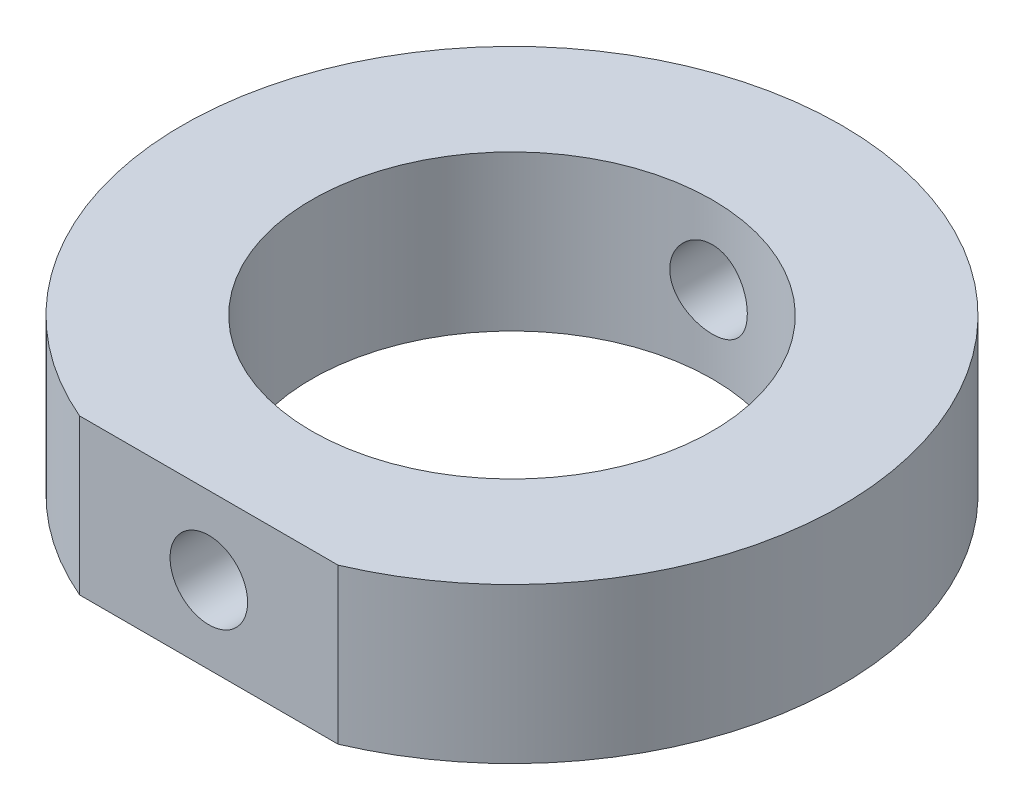
ISO-10303-21;
HEADER;
FILE_DESCRIPTION(('STEP AP214'),'2;1');
FILE_NAME('part.step','',(''),(''),'','','');
FILE_SCHEMA(('AUTOMOTIVE_DESIGN { 1 0 10303 214 1 1 1 1 }'));
ENDSEC;
DATA;
#1=APPLICATION_CONTEXT('core data for automotive mechanical design processes');
#2=APPLICATION_PROTOCOL_DEFINITION('international standard','automotive_design',2000,#1);
#3=PRODUCT_CONTEXT('',#1,'mechanical');
#4=PRODUCT('Part','Part','',(#3));
#5=PRODUCT_RELATED_PRODUCT_CATEGORY('part','',(#4));
#6=PRODUCT_DEFINITION_FORMATION('','',#4);
#7=PRODUCT_DEFINITION_CONTEXT('part definition',#1,'design');
#8=PRODUCT_DEFINITION('design','',#6,#7);
#9=PRODUCT_DEFINITION_SHAPE('','',#8);
#10=(LENGTH_UNIT() NAMED_UNIT(*) SI_UNIT(.MILLI.,.METRE.));
#11=(NAMED_UNIT(*) PLANE_ANGLE_UNIT() SI_UNIT($,.RADIAN.));
#12=(NAMED_UNIT(*) SI_UNIT($,.STERADIAN.) SOLID_ANGLE_UNIT());
#13=UNCERTAINTY_MEASURE_WITH_UNIT(LENGTH_MEASURE(1.E-05),#10,'distance_accuracy_value','');
#14=(GEOMETRIC_REPRESENTATION_CONTEXT(3) GLOBAL_UNCERTAINTY_ASSIGNED_CONTEXT((#13)) GLOBAL_UNIT_ASSIGNED_CONTEXT((#10,
#11,#12)) REPRESENTATION_CONTEXT('',''));
#15=CARTESIAN_POINT('',(0.,0.,0.));
#16=DIRECTION('',(0.,0.,1.));
#17=DIRECTION('',(1.,0.,0.));
#18=AXIS2_PLACEMENT_3D('',#15,#16,#17);
#19=CARTESIAN_POINT('',(0.,6.,0.));
#20=DIRECTION('',(0.,-1.,0.));
#21=DIRECTION('',(0.,0.,-1.));
#22=AXIS2_PLACEMENT_3D('',#19,#20,#21);
#23=PLANE('',#22);
#24=CARTESIAN_POINT('',(0.,6.,0.));
#25=DIRECTION('',(0.,1.,0.));
#26=DIRECTION('',(0.,0.,-1.));
#27=AXIS2_PLACEMENT_3D('',#24,#25,#26);
#28=CIRCLE('',#27,12.75);
#29=CARTESIAN_POINT('',(5.,6.,11.7287041057399));
#30=VERTEX_POINT('',#29);
#31=CARTESIAN_POINT('',(-5.,6.,11.7287041057399));
#32=VERTEX_POINT('',#31);
#33=EDGE_CURVE('E86',#30,#32,#28,.T.);
#34=ORIENTED_EDGE('',*,*,#33,.T.);
#35=DIRECTION('',(1.,0.,0.));
#36=VECTOR('',#35,1.);
#37=CARTESIAN_POINT('',(-5.,6.,11.7287041057399));
#38=LINE('',#37,#36);
#39=EDGE_CURVE('E70',#32,#30,#38,.T.);
#40=ORIENTED_EDGE('',*,*,#39,.T.);
#41=EDGE_LOOP('',(#34,#40));
#42=FACE_BOUND('',#41,.T.);
#43=CARTESIAN_POINT('',(0.,6.,0.));
#44=DIRECTION('',(0.,1.,0.));
#45=DIRECTION('',(0.,0.,1.));
#46=AXIS2_PLACEMENT_3D('',#43,#44,#45);
#47=CIRCLE('',#46,7.75);
#48=CARTESIAN_POINT('',(0.,6.,7.75));
#49=VERTEX_POINT('',#48);
#50=EDGE_CURVE('E95',#49,#49,#47,.T.);
#51=ORIENTED_EDGE('',*,*,#50,.F.);
#52=EDGE_LOOP('',(#51));
#53=FACE_BOUND('',#52,.T.);
#54=ADVANCED_FACE('F45',(#42,#53),#23,.F.);
#55=CARTESIAN_POINT('',(0.,0.,0.));
#56=DIRECTION('',(0.,-1.,0.));
#57=DIRECTION('',(0.,0.,-1.));
#58=AXIS2_PLACEMENT_3D('',#55,#56,#57);
#59=PLANE('',#58);
#60=CARTESIAN_POINT('',(0.,0.,0.));
#61=DIRECTION('',(0.,1.,0.));
#62=DIRECTION('',(0.,0.,-1.));
#63=AXIS2_PLACEMENT_3D('',#60,#61,#62);
#64=CIRCLE('',#63,12.75);
#65=CARTESIAN_POINT('',(5.,0.,11.7287041057399));
#66=VERTEX_POINT('',#65);
#67=CARTESIAN_POINT('',(-5.,0.,11.7287041057399));
#68=VERTEX_POINT('',#67);
#69=EDGE_CURVE('E87',#66,#68,#64,.T.);
#70=ORIENTED_EDGE('',*,*,#69,.F.);
#71=DIRECTION('',(1.,0.,0.));
#72=VECTOR('',#71,1.);
#73=CARTESIAN_POINT('',(-5.,0.,11.7287041057399));
#74=LINE('',#73,#72);
#75=EDGE_CURVE('E78',#68,#66,#74,.T.);
#76=ORIENTED_EDGE('',*,*,#75,.F.);
#77=EDGE_LOOP('',(#70,#76));
#78=FACE_BOUND('',#77,.T.);
#79=CARTESIAN_POINT('',(0.,0.,0.));
#80=DIRECTION('',(0.,1.,0.));
#81=DIRECTION('',(0.,0.,1.));
#82=AXIS2_PLACEMENT_3D('',#79,#80,#81);
#83=CIRCLE('',#82,7.75);
#84=CARTESIAN_POINT('',(0.,0.,7.75));
#85=VERTEX_POINT('',#84);
#86=EDGE_CURVE('E99',#85,#85,#83,.T.);
#87=ORIENTED_EDGE('',*,*,#86,.T.);
#88=EDGE_LOOP('',(#87));
#89=FACE_BOUND('',#88,.T.);
#90=ADVANCED_FACE('F92',(#78,#89),#59,.T.);
#91=CARTESIAN_POINT('',(0.,6.,0.));
#92=DIRECTION('',(0.,-1.,0.));
#93=DIRECTION('',(0.,0.,-1.));
#94=AXIS2_PLACEMENT_3D('',#91,#92,#93);
#95=CYLINDRICAL_SURFACE('',#94,12.75);
#96=CARTESIAN_POINT('',(0.,1.5,-12.75));
#97=CARTESIAN_POINT('',(0.0839445238017769,1.50000358968787,-12.7499988863998));
#98=CARTESIAN_POINT('',(0.167942470163587,1.50707043173212,-12.7491622059457));
#99=CARTESIAN_POINT('',(0.333603720017564,1.53515144231694,-12.74590499263));
#100=CARTESIAN_POINT('',(0.415264446886993,1.55618042878211,-12.7434827770899));
#101=CARTESIAN_POINT('',(0.573828777464401,1.61155994331746,-12.7373275435105));
#102=CARTESIAN_POINT('',(0.650735441768553,1.64590179498285,-12.7335953793546));
#103=CARTESIAN_POINT('',(0.797678339972702,1.72691387258974,-12.7252360454028));
#104=CARTESIAN_POINT('',(0.867715808463592,1.77358187758043,-12.7206090368819));
#105=CARTESIAN_POINT('',(0.99929086233086,1.87816638509886,-12.7109517928896));
#106=CARTESIAN_POINT('',(1.06078994573301,1.93613117612404,-12.7059198828822));
#107=CARTESIAN_POINT('',(1.17321109755621,2.0615603215165,-12.6960335724401));
#108=CARTESIAN_POINT('',(1.224132643315,2.12902514502759,-12.6911791807867));
#109=CARTESIAN_POINT('',(1.31409465484568,2.27178686024288,-12.6821809090172));
#110=CARTESIAN_POINT('',(1.3530994028419,2.34710640698438,-12.6780391808357));
#111=CARTESIAN_POINT('',(1.41789253518226,2.50328336365698,-12.6709569272581));
#112=CARTESIAN_POINT('',(1.44368136485536,2.58414058688419,-12.6680163613879));
#113=CARTESIAN_POINT('',(1.4811944199708,2.74869991374292,-12.6636851530451));
#114=CARTESIAN_POINT('',(1.49298334554177,2.83238707745297,-12.662287382723));
#115=CARTESIAN_POINT('',(1.50236208892495,3.00056284546421,-12.6611781333382));
#116=CARTESIAN_POINT('',(1.49995241481201,3.08505142098012,-12.6614665939364));
#117=CARTESIAN_POINT('',(1.48105553765642,3.2519823500222,-12.6636906931516));
#118=CARTESIAN_POINT('',(1.4646394043017,3.33443287525134,-12.6656180159087));
#119=CARTESIAN_POINT('',(1.41830639263226,3.49540056102071,-12.6708897060061));
#120=CARTESIAN_POINT('',(1.38838926944282,3.57391765018937,-12.6742340990486));
#121=CARTESIAN_POINT('',(1.3158264763494,3.72501161794973,-12.6819725804852));
#122=CARTESIAN_POINT('',(1.27314971803356,3.79757342997342,-12.6863692273787));
#123=CARTESIAN_POINT('',(1.17630136070668,3.93453205552891,-12.695714796948));
#124=CARTESIAN_POINT('',(1.12212929576825,3.99892853793477,-12.7006637420056));
#125=CARTESIAN_POINT('',(1.00343322690704,4.11814118716693,-12.7105932908786));
#126=CARTESIAN_POINT('',(0.938847926412598,4.17289634082805,-12.7155739031702));
#127=CARTESIAN_POINT('',(0.801370343056217,4.27079766100761,-12.7249771989112));
#128=CARTESIAN_POINT('',(0.728478044572468,4.3139438056941,-12.7293998813114));
#129=CARTESIAN_POINT('',(0.576410071646914,4.38740160066974,-12.7371913118727));
#130=CARTESIAN_POINT('',(0.497232646746879,4.41770966045214,-12.7405597651223));
#131=CARTESIAN_POINT('',(0.334864099663829,4.46458369808535,-12.7458604426276));
#132=CARTESIAN_POINT('',(0.251673143970352,4.4811502454447,-12.7477927264041));
#133=CARTESIAN_POINT('',(0.0841668293733031,4.49999244834819,-12.7499956438523));
#134=CARTESIAN_POINT('',(-0.000138946641102072,4.50235219804915,-12.750276055223));
#135=CARTESIAN_POINT('',(-0.167944751818134,4.49293541256864,-12.7491699754329));
#136=CARTESIAN_POINT('',(-0.251444796110695,4.48115914335441,-12.747783515634));
#137=CARTESIAN_POINT('',(-0.415022458911957,4.44387443839986,-12.7435056127914));
#138=CARTESIAN_POINT('',(-0.495109288820112,4.41840587144105,-12.7406185399892));
#139=CARTESIAN_POINT('',(-0.649874743903773,4.35450082818682,-12.7336628348918));
#140=CARTESIAN_POINT('',(-0.724553204671253,4.31606395787112,-12.7295941666962));
#141=CARTESIAN_POINT('',(-0.866759123025255,4.22710831778111,-12.7207049523328));
#142=CARTESIAN_POINT('',(-0.934252169210274,4.17653487948445,-12.7158810393999));
#143=CARTESIAN_POINT('',(-1.05982183694368,4.06481936695087,-12.7060321235032));
#144=CARTESIAN_POINT('',(-1.11789812863895,4.00367692265433,-12.7010071135029));
#145=CARTESIAN_POINT('',(-1.22328206862583,3.87218966579649,-12.6912924167809));
#146=CARTESIAN_POINT('',(-1.27053414492072,3.80180016043869,-12.6866045417088));
#147=CARTESIAN_POINT('',(-1.35254502918872,3.65403487361152,-12.678124032712));
#148=CARTESIAN_POINT('',(-1.38730406313073,3.57665921853638,-12.6743313825954));
#149=CARTESIAN_POINT('',(-1.44325123543802,3.4173009128721,-12.6680828015291));
#150=CARTESIAN_POINT('',(-1.46447125296069,3.3353295825964,-12.6656237325762));
#151=CARTESIAN_POINT('',(-1.49284095573644,3.16895654684123,-12.6623115270215));
#152=CARTESIAN_POINT('',(-1.49999121512984,3.08455494067589,-12.6614583248896));
#153=CARTESIAN_POINT('',(-1.50000871531396,2.91626987777497,-12.6614562076871));
#154=CARTESIAN_POINT('',(-1.49296325449793,2.83238641677722,-12.662296875945));
#155=CARTESIAN_POINT('',(-1.46497359599684,2.66700436588238,-12.6655654420645));
#156=CARTESIAN_POINT('',(-1.44402939180228,2.58550577710227,-12.6679933406696));
#157=CARTESIAN_POINT('',(-1.38886308611661,2.42721502791031,-12.6741596896421));
#158=CARTESIAN_POINT('',(-1.35464468084386,2.35042156423695,-12.6778977751583));
#159=CARTESIAN_POINT('',(-1.27390996227888,2.20365295769552,-12.6862639594338));
#160=CARTESIAN_POINT('',(-1.22739356481404,2.13367786149971,-12.6908920642846));
#161=CARTESIAN_POINT('',(-1.12305792897877,2.00208555975102,-12.7005509388172));
#162=CARTESIAN_POINT('',(-1.06517358276859,1.94052013601489,-12.7055839244218));
#163=CARTESIAN_POINT('',(-0.939879579424026,1.82794187041473,-12.7154656568386));
#164=CARTESIAN_POINT('',(-0.872467669264752,1.77693153160867,-12.7203143597275));
#165=CARTESIAN_POINT('',(-0.729773340821654,1.68676725529446,-12.7292990710803));
#166=CARTESIAN_POINT('',(-0.654465054514433,1.64765403417534,-12.7334326116393));
#167=CARTESIAN_POINT('',(-0.498344623668371,1.58268355476477,-12.7404958231895));
#168=CARTESIAN_POINT('',(-0.417538642694656,1.5568117199707,-12.7434268172705));
#169=CARTESIAN_POINT('',(-0.280251375756951,1.52533370656963,-12.7470386021763));
#170=CARTESIAN_POINT('',(-0.224639844767083,1.51584700409509,-12.7481437901749));
#171=CARTESIAN_POINT('',(-0.112693566298985,1.50317896552839,-12.7496248606286));
#172=CARTESIAN_POINT('',(-0.0563588233521066,1.49999758994899,-12.7500007476509));
#173=CARTESIAN_POINT('',(0.,1.5,-12.75));
#174=B_SPLINE_CURVE_WITH_KNOTS('',3,(#96,#97,#98,#99,#100,#101,#102,#103,#104,#105,#106,#107,
#108,#109,#110,#111,#112,#113,#114,#115,#116,#117,#118,#119,#120,#121,#122,#123,#124,#125,#126,
#127,#128,#129,#130,#131,#132,#133,#134,#135,#136,#137,#138,#139,#140,#141,#142,#143,#144,#145,
#146,#147,#148,#149,#150,#151,#152,#153,#154,#155,#156,#157,#158,#159,#160,#161,#162,#163,#164,
#165,#166,#167,#168,#169,#170,#171,#172,#173),.UNSPECIFIED.,.T.,.F.,(4,2,2,2,2,2,2,2,2,2,2,2,2,
2,2,2,2,2,2,2,2,2,2,2,2,2,2,2,2,2,2,2,2,2,2,2,2,2,4),(0.,0.251627729781729,0.503522938067275,
0.75525425373159,1.00694024285275,1.25972665179056,1.51252554855898,1.76607488029362,
2.01961566776529,2.27198010689134,2.5243355156027,2.77541801991742,3.02650507843398,
3.27820895762529,3.52992304081927,3.78317687865799,4.03643119276375,4.28975628938195,
4.54307088657282,4.79488455520337,5.04669348606903,5.29777314794787,5.54886043915063,
5.80110070045379,6.05334979540249,6.30686628875544,6.56037819637747,6.81329095670036,
7.06619339627562,7.31754532700981,7.56889737546506,7.82017948479908,8.07146331405794,
8.32423065993315,8.57705787913526,8.83074087667477,9.08414400868152,9.25308333841263,
9.42202161015442),.UNSPECIFIED.);
#175=CARTESIAN_POINT('',(0.,1.5,-12.75));
#176=VERTEX_POINT('',#175);
#177=EDGE_CURVE('E121',#176,#176,#174,.T.);
#178=ORIENTED_EDGE('',*,*,#177,.T.);
#179=EDGE_LOOP('',(#178));
#180=FACE_BOUND('',#179,.T.);
#181=ORIENTED_EDGE('',*,*,#69,.T.);
#182=DIRECTION('',(0.,-1.,0.));
#183=VECTOR('',#182,1.);
#184=CARTESIAN_POINT('',(-5.,6.,11.7287041057399));
#185=LINE('',#184,#183);
#186=EDGE_CURVE('E11',#32,#68,#185,.T.);
#187=ORIENTED_EDGE('',*,*,#186,.F.);
#188=ORIENTED_EDGE('',*,*,#33,.F.);
#189=DIRECTION('',(0.,-1.,0.));
#190=VECTOR('',#189,1.);
#191=CARTESIAN_POINT('',(5.,6.,11.7287041057399));
#192=LINE('',#191,#190);
#193=EDGE_CURVE('E62',#30,#66,#192,.T.);
#194=ORIENTED_EDGE('',*,*,#193,.T.);
#195=EDGE_LOOP('',(#181,#187,#188,#194));
#196=FACE_BOUND('',#195,.T.);
#197=ADVANCED_FACE('F47',(#180,#196),#95,.T.);
#198=CARTESIAN_POINT('',(-5.,6.,11.7287041057399));
#199=DIRECTION('',(0.,0.,-1.));
#200=DIRECTION('',(-1.,0.,0.));
#201=AXIS2_PLACEMENT_3D('',#198,#199,#200);
#202=PLANE('',#201);
#203=CARTESIAN_POINT('',(0.,3.,11.7287041057399));
#204=DIRECTION('',(0.,0.,1.));
#205=DIRECTION('',(1.,0.,0.));
#206=AXIS2_PLACEMENT_3D('',#203,#204,#205);
#207=CIRCLE('',#206,1.5);
#208=CARTESIAN_POINT('',(1.5,3.,11.7287041057399));
#209=VERTEX_POINT('',#208);
#210=EDGE_CURVE('E109',#209,#209,#207,.T.);
#211=ORIENTED_EDGE('',*,*,#210,.F.);
#212=EDGE_LOOP('',(#211));
#213=FACE_BOUND('',#212,.T.);
#214=ORIENTED_EDGE('',*,*,#75,.T.);
#215=ORIENTED_EDGE('',*,*,#193,.F.);
#216=ORIENTED_EDGE('',*,*,#39,.F.);
#217=ORIENTED_EDGE('',*,*,#186,.T.);
#218=EDGE_LOOP('',(#214,#215,#216,#217));
#219=FACE_BOUND('',#218,.T.);
#220=ADVANCED_FACE('F81',(#213,#219),#202,.F.);
#221=CARTESIAN_POINT('',(0.,6.,0.));
#222=DIRECTION('',(0.,-1.,0.));
#223=DIRECTION('',(0.,0.,-1.));
#224=AXIS2_PLACEMENT_3D('',#221,#222,#223);
#225=CYLINDRICAL_SURFACE('',#224,7.75);
#226=CARTESIAN_POINT('',(0.,4.5,-7.75));
#227=CARTESIAN_POINT('',(-0.0834210787139819,4.49999686731769,-7.74999847408196));
#228=CARTESIAN_POINT('',(-0.166882359307396,4.49301740865632,-7.74863921449565));
#229=CARTESIAN_POINT('',(-0.331449592125704,4.46530395337289,-7.74334791734644));
#230=CARTESIAN_POINT('',(-0.412553555037757,4.44455867266346,-7.73941376913806));
#231=CARTESIAN_POINT('',(-0.570002657544576,4.38997538033738,-7.72941240772484));
#232=CARTESIAN_POINT('',(-0.64635214294661,4.35614953511509,-7.7233471771437));
#233=CARTESIAN_POINT('',(-0.792285992836983,4.27640061901852,-7.70974455178129));
#234=CARTESIAN_POINT('',(-0.861870835242917,4.23047840359644,-7.70220726111347));
#235=CARTESIAN_POINT('',(-0.99319167595435,4.12722046724469,-7.6863840905269));
#236=CARTESIAN_POINT('',(-1.05482918133122,4.06976063022284,-7.67809065789604));
#237=CARTESIAN_POINT('',(-1.16765325234664,3.9453254304938,-7.66174545065496));
#238=CARTESIAN_POINT('',(-1.2188390366218,3.87834935699369,-7.65369369415063));
#239=CARTESIAN_POINT('',(-1.30972091001982,3.73608090868428,-7.63866991902306));
#240=CARTESIAN_POINT('',(-1.3493159525154,3.66072286671957,-7.63170762900968));
#241=CARTESIAN_POINT('',(-1.41524529666488,3.50426687565965,-7.61975791069809));
#242=CARTESIAN_POINT('',(-1.44158082073674,3.42316945647407,-7.6147703003598));
#243=CARTESIAN_POINT('',(-1.47992571756973,3.2585934372158,-7.60741086759107));
#244=CARTESIAN_POINT('',(-1.49210735695917,3.17515640746075,-7.60500761838759));
#245=CARTESIAN_POINT('',(-1.50233357526115,3.00739085682817,-7.60299433869807));
#246=CARTESIAN_POINT('',(-1.50037950628534,2.92306242198599,-7.60338404106004));
#247=CARTESIAN_POINT('',(-1.48252926887088,2.75716172079978,-7.60688404856427));
#248=CARTESIAN_POINT('',(-1.4668297435929,2.67556736674805,-7.60995597992223));
#249=CARTESIAN_POINT('',(-1.42224426701012,2.51619296499398,-7.61841397136506));
#250=CARTESIAN_POINT('',(-1.39335772220132,2.43841308914313,-7.62380013560523));
#251=CARTESIAN_POINT('',(-1.32302804854628,2.28830429148535,-7.63631940233068));
#252=CARTESIAN_POINT('',(-1.28150621416483,2.2160131913663,-7.64346339941792));
#253=CARTESIAN_POINT('',(-1.18714021425914,2.07935053899544,-7.65868628007988));
#254=CARTESIAN_POINT('',(-1.13429482702252,2.0149798424666,-7.66676526448826));
#255=CARTESIAN_POINT('',(-1.01772509823794,1.89484979118729,-7.68311457012869));
#256=CARTESIAN_POINT('',(-0.953832732873424,1.83925347913067,-7.6913858240859));
#257=CARTESIAN_POINT('',(-0.817543107605094,1.73954276410473,-7.70706304694415));
#258=CARTESIAN_POINT('',(-0.745145751494432,1.6954284910362,-7.71446900605523));
#259=CARTESIAN_POINT('',(-0.593725914754121,1.61990715897721,-7.72759765137465));
#260=CARTESIAN_POINT('',(-0.514694360575272,1.58851785724516,-7.73331798232966));
#261=CARTESIAN_POINT('',(-0.352344598280829,1.53950661287005,-7.74241280644494));
#262=CARTESIAN_POINT('',(-0.269026877044974,1.52188311018931,-7.74578756541723));
#263=CARTESIAN_POINT('',(-0.101871802484302,1.50113252155269,-7.74977424845929));
#264=CARTESIAN_POINT('',(-0.0180631478958456,1.49778217018744,-7.75042872018128));
#265=CARTESIAN_POINT('',(0.148916632529926,1.50507296083675,-7.74901892693282));
#266=CARTESIAN_POINT('',(0.232087791602669,1.51571336839246,-7.74695480467765));
#267=CARTESIAN_POINT('',(0.394717725412861,1.55049807235455,-7.7403663072359));
#268=CARTESIAN_POINT('',(0.474201738407223,1.57452864109975,-7.73586266070818));
#269=CARTESIAN_POINT('',(0.628012475405678,1.6352878833816,-7.72489811710861));
#270=CARTESIAN_POINT('',(0.702338831219204,1.67201746234729,-7.71843708048053));
#271=CARTESIAN_POINT('',(0.844671894023758,1.75762094227588,-7.7041683619824));
#272=CARTESIAN_POINT('',(0.912595621279698,1.80663031218863,-7.69634597748223));
#273=CARTESIAN_POINT('',(1.03933496632102,1.91521978461092,-7.68025855618537));
#274=CARTESIAN_POINT('',(1.09814967272472,1.97480094357803,-7.67199347520694));
#275=CARTESIAN_POINT('',(1.20585617272696,2.10385618280201,-7.65580995071658));
#276=CARTESIAN_POINT('',(1.25459516224029,2.17345875641351,-7.64789809799975));
#277=CARTESIAN_POINT('',(1.33969011925474,2.31999423858008,-7.63345275472628));
#278=CARTESIAN_POINT('',(1.37604656466947,2.39692686407959,-7.62691921097647));
#279=CARTESIAN_POINT('',(1.43513157210702,2.55556290858282,-7.61602267841533));
#280=CARTESIAN_POINT('',(1.45792829947187,2.6372401593918,-7.61164885180106));
#281=CARTESIAN_POINT('',(1.48945537425568,2.80335883926439,-7.60554305407608));
#282=CARTESIAN_POINT('',(1.49818742553264,2.88779993223897,-7.60381076295927));
#283=CARTESIAN_POINT('',(1.50127736967434,3.05551705239209,-7.60320113886837));
#284=CARTESIAN_POINT('',(1.49587649128859,3.13878855577927,-7.60427589307599));
#285=CARTESIAN_POINT('',(1.47138405136503,3.30321243066356,-7.60905263452398));
#286=CARTESIAN_POINT('',(1.45229258467931,3.38436481683845,-7.61275460356229));
#287=CARTESIAN_POINT('',(1.40106548612556,3.54210576871194,-7.62234788207545));
#288=CARTESIAN_POINT('',(1.36895762664975,3.61870365557393,-7.62823452797357));
#289=CARTESIAN_POINT('',(1.29263615483108,3.76546343788171,-7.64153687010842));
#290=CARTESIAN_POINT('',(1.24842161044272,3.83562483725251,-7.64895268405886));
#291=CARTESIAN_POINT('',(1.14831022070382,3.96872497905872,-7.66462550473274));
#292=CARTESIAN_POINT('',(1.09223845338799,4.03153082047092,-7.67289403231619));
#293=CARTESIAN_POINT('',(0.970367356758542,4.14692213338329,-7.68925611889744));
#294=CARTESIAN_POINT('',(0.904565796081146,4.19950525405505,-7.69734963727052));
#295=CARTESIAN_POINT('',(0.764337841919685,4.29343704993912,-7.71254202408635));
#296=CARTESIAN_POINT('',(0.689834048073539,4.33467191895233,-7.71963049375684));
#297=CARTESIAN_POINT('',(0.534840677982818,4.40397224097681,-7.73191220790458));
#298=CARTESIAN_POINT('',(0.454356695930214,4.43204982672331,-7.73710719743173));
#299=CARTESIAN_POINT('',(0.311385193383974,4.46866252966338,-7.74398117253215));
#300=CARTESIAN_POINT('',(0.249723311606212,4.48039358676935,-7.74622526720601));
#301=CARTESIAN_POINT('',(0.125381838034376,4.49606338868456,-7.74923523343163));
#302=CARTESIAN_POINT('',(0.0627022751733916,4.5000023546364,-7.75000114693474));
#303=CARTESIAN_POINT('',(0.,4.5,-7.75));
#304=B_SPLINE_CURVE_WITH_KNOTS('',3,(#226,#227,#228,#229,#230,#231,#232,#233,#234,#235,#236,
#237,#238,#239,#240,#241,#242,#243,#244,#245,#246,#247,#248,#249,#250,#251,#252,#253,#254,#255,
#256,#257,#258,#259,#260,#261,#262,#263,#264,#265,#266,#267,#268,#269,#270,#271,#272,#273,#274,
#275,#276,#277,#278,#279,#280,#281,#282,#283,#284,#285,#286,#287,#288,#289,#290,#291,#292,#293,
#294,#295,#296,#297,#298,#299,#300,#301,#302,#303),.UNSPECIFIED.,.T.,.F.,(4,2,2,2,2,2,2,2,2,2,2,
2,2,2,2,2,2,2,2,2,2,2,2,2,2,2,2,2,2,2,2,2,2,2,2,2,2,2,4),(0.,0.250033893279061,
0.500272997362748,0.750279908627459,1.00026914421188,1.25310753798955,1.5059648268747,
1.76096497917487,2.01594161826314,2.26778131268177,2.51959691839715,2.76786784168443,
3.01614993992392,3.26601139971541,3.51589983096031,3.76999112259671,4.02408528874255,
4.27853282397684,4.53295151923209,4.78337555478589,5.03378644460482,5.28210222477901,
5.53043571331732,5.78163969279567,6.03286878968402,6.28766619193877,6.5424537589811,
6.79594942792411,7.04941438495324,7.2985813914746,7.54774667171633,7.79638309590845,
8.04503866701401,8.2976563623792,8.55033208145761,8.80545637409624,9.06034494357577,
9.24828472065447,9.4362191638521),.UNSPECIFIED.);
#305=CARTESIAN_POINT('',(0.,4.5,-7.75));
#306=VERTEX_POINT('',#305);
#307=EDGE_CURVE('E50',#306,#306,#304,.T.);
#308=ORIENTED_EDGE('',*,*,#307,.F.);
#309=EDGE_LOOP('',(#308));
#310=FACE_BOUND('',#309,.T.);
#311=CARTESIAN_POINT('',(1.5,3.,7.60345316287277));
#312=CARTESIAN_POINT('',(1.49999685439353,2.91659541849444,7.60345480059779));
#313=CARTESIAN_POINT('',(1.49302006257095,2.83315059972123,7.60484040926383));
#314=CARTESIAN_POINT('',(1.46531815984109,2.66861754974085,7.6102256421657));
#315=CARTESIAN_POINT('',(1.44458170165493,2.58753132126788,7.61422742385871));
#316=CARTESIAN_POINT('',(1.39002420338679,2.43011977329355,7.62437518180366));
#317=CARTESIAN_POINT('',(1.35621574451663,2.35378995773196,7.63051909579281));
#318=CARTESIAN_POINT('',(1.27650781003881,2.20788925570644,7.64425640786802));
#319=CARTESIAN_POINT('',(1.23060914956621,2.13831791401123,7.65184970822532));
#320=CARTESIAN_POINT('',(1.12737533881698,2.00698261877152,7.6677426282145));
#321=CARTESIAN_POINT('',(1.06991078424136,1.94532125116044,7.67604956809132));
#322=CARTESIAN_POINT('',(0.945456027917871,1.832450899917,7.69236923850029));
#323=CARTESIAN_POINT('',(0.878465181403059,1.78124262435193,7.70038194907191));
#324=CARTESIAN_POINT('',(0.736183007593965,1.69033658909142,7.71528902015384));
#325=CARTESIAN_POINT('',(0.660828553304926,1.65073591780886,7.72217374639853));
#326=CARTESIAN_POINT('',(0.504380326037486,1.58479518784726,7.73396704845971));
#327=CARTESIAN_POINT('',(0.423287056680342,1.55845396720035,7.73887579742983));
#328=CARTESIAN_POINT('',(0.258726964166356,1.52009810742902,7.74611235220277));
#329=CARTESIAN_POINT('',(0.175301875304082,1.50791038908556,7.74847131337729));
#330=CARTESIAN_POINT('',(0.00755994346299234,1.49766787116769,7.75044998959771));
#331=CARTESIAN_POINT('',(-0.0767568181290256,1.49961179266742,7.75006995252539));
#332=CARTESIAN_POINT('',(-0.242700568782161,1.51744533168745,7.7466377012943));
#333=CARTESIAN_POINT('',(-0.324348435246634,1.53314855249825,7.74362120451896));
#334=CARTESIAN_POINT('',(-0.483827925828211,1.57775972700048,7.73529513256784));
#335=CARTESIAN_POINT('',(-0.561659404130689,1.60666818479627,7.72998546985184));
#336=CARTESIAN_POINT('',(-0.711833183060388,1.67704448127104,7.71761035934617));
#337=CARTESIAN_POINT('',(-0.784140016083082,1.71858612301351,7.71053463900675));
#338=CARTESIAN_POINT('',(-0.920825866099978,1.81299508331819,7.6954087382739));
#339=CARTESIAN_POINT('',(-0.985204025033975,1.86586362601168,7.68735845259728));
#340=CARTESIAN_POINT('',(-1.10531031615948,1.98245061584253,7.67101877219633));
#341=CARTESIAN_POINT('',(-1.16088000084011,2.04633216466762,7.66272761963731));
#342=CARTESIAN_POINT('',(-1.26054202993602,2.18259038110514,7.64696588981027));
#343=CARTESIAN_POINT('',(-1.30463418386715,2.25496718967822,7.63949532616214));
#344=CARTESIAN_POINT('',(-1.3801392050917,2.4063798039563,7.62621762421056));
#345=CARTESIAN_POINT('',(-1.41152779851953,2.48542801242554,7.62041367655095));
#346=CARTESIAN_POINT('',(-1.46053260389754,2.6478142097866,7.61117419405551));
#347=CARTESIAN_POINT('',(-1.47815048732694,2.73115167674197,7.60773837178426));
#348=CARTESIAN_POINT('',(-1.49887982443603,2.89831848408188,7.60368136828337));
#349=CARTESIAN_POINT('',(-1.5022194760008,2.98211848283188,7.60301591496911));
#350=CARTESIAN_POINT('',(-1.49491037854478,3.14907844953149,7.60445634891234));
#351=CARTESIAN_POINT('',(-1.48426236936987,3.2322384510983,7.60656208959375));
#352=CARTESIAN_POINT('',(-1.44947650821075,3.39479960532719,7.61326630342256));
#353=CARTESIAN_POINT('',(-1.42545937972978,3.47422759472206,7.61784245766153));
#354=CARTESIAN_POINT('',(-1.36474560170502,3.62793217672282,7.62895248978107));
#355=CARTESIAN_POINT('',(-1.32804796477903,3.70220836763713,7.63548652010863));
#356=CARTESIAN_POINT('',(-1.2424937932493,3.84450301339605,7.64987625536461));
#357=CARTESIAN_POINT('',(-1.19349375377465,3.91243361804525,7.65774717703179));
#358=CARTESIAN_POINT('',(-1.08491815868584,4.03919113005543,7.6738815413606));
#359=CARTESIAN_POINT('',(-1.02534158688667,4.09801716163864,7.68214502168304));
#360=CARTESIAN_POINT('',(-0.896282392202774,4.20575424084721,7.69827636072951));
#361=CARTESIAN_POINT('',(-0.826670259318585,4.25451142356308,7.70613686946989));
#362=CARTESIAN_POINT('',(-0.680110215907829,4.33963826362907,7.72045097756058));
#363=CARTESIAN_POINT('',(-0.603162600569711,4.37600841917866,7.72690463348998));
#364=CARTESIAN_POINT('',(-0.444531128955397,4.43510133948578,7.73764638175247));
#365=CARTESIAN_POINT('',(-0.362875681516067,4.45789814025774,7.7419462014096));
#366=CARTESIAN_POINT('',(-0.196803478833556,4.48943272645403,7.74794596216878));
#367=CARTESIAN_POINT('',(-0.112387035181444,4.49817209277651,7.74964619561905));
#368=CARTESIAN_POINT('',(0.0553381485743528,4.5012857403063,7.75024887680773));
#369=CARTESIAN_POINT('',(0.138642509665891,4.49589190159464,7.74919648668172));
#370=CARTESIAN_POINT('',(0.303133976471832,4.47140207378102,7.74450654185662));
#371=CARTESIAN_POINT('',(0.384321105409351,4.45230623503668,7.74086901552529));
#372=CARTESIAN_POINT('',(0.542140482176445,4.40105475683688,7.73141811110006));
#373=CARTESIAN_POINT('',(0.618781516914106,4.36892531924906,7.72560910024074));
#374=CARTESIAN_POINT('',(0.765618760747929,4.29254718134467,7.71244245668555));
#375=CARTESIAN_POINT('',(0.835814500144604,4.24829759870965,7.70508471125443));
#376=CARTESIAN_POINT('',(0.968919813050733,4.14814468806305,7.68949015366312));
#377=CARTESIAN_POINT('',(1.03170256405398,4.09207460551097,7.68124168972985));
#378=CARTESIAN_POINT('',(1.14704807179239,3.97021675776657,7.66486679649694));
#379=CARTESIAN_POINT('',(1.19960841429264,3.90442670344019,7.65674039644237));
#380=CARTESIAN_POINT('',(1.29351200265188,3.7642108574983,7.64144089885757));
#381=CARTESIAN_POINT('',(1.33473822861257,3.6897055305217,7.63427810996937));
#382=CARTESIAN_POINT('',(1.40402198364564,3.53470964389992,7.62184172874311));
#383=CARTESIAN_POINT('',(1.43209171319695,3.45422470993131,7.61656638718803));
#384=CARTESIAN_POINT('',(1.46868516807921,3.31127343427403,7.60957989710382));
#385=CARTESIAN_POINT('',(1.48040768536241,3.24963398405732,7.60729629751977));
#386=CARTESIAN_POINT('',(1.49606616443219,3.12533724351248,7.60423233796527));
#387=CARTESIAN_POINT('',(1.50000236397762,3.06267998432252,7.60345193209412));
#388=CARTESIAN_POINT('',(1.5,3.,7.60345316287277));
#389=B_SPLINE_CURVE_WITH_KNOTS('',3,(#311,#312,#313,#314,#315,#316,#317,#318,#319,#320,#321,
#322,#323,#324,#325,#326,#327,#328,#329,#330,#331,#332,#333,#334,#335,#336,#337,#338,#339,#340,
#341,#342,#343,#344,#345,#346,#347,#348,#349,#350,#351,#352,#353,#354,#355,#356,#357,#358,#359,
#360,#361,#362,#363,#364,#365,#366,#367,#368,#369,#370,#371,#372,#373,#374,#375,#376,#377,#378,
#379,#380,#381,#382,#383,#384,#385,#386,#387,#388),.UNSPECIFIED.,.T.,.F.,(4,2,2,2,2,2,2,2,2,2,2,
2,2,2,2,2,2,2,2,2,2,2,2,2,2,2,2,2,2,2,2,2,2,2,2,2,2,2,4),(0.,0.249984308522542,
0.500175029970166,0.750125551121019,1.00005922463658,1.25296251314691,1.50588292703658,
1.76086210846146,2.01581894135733,2.26762400798209,2.51940628631022,2.76782951576251,
3.01626222945956,3.26617511457583,3.51611502214433,3.77013702768127,4.02416324876609,
4.27867259518559,4.53315104463804,4.78354679254319,5.03392929686133,5.28208668291583,
5.53026339638327,5.78148171418909,6.03272418193171,6.28756052836482,6.54238662420873,
6.79580972298289,7.04920431981904,7.29846766409557,7.54772827314609,7.7964902493509,
8.04527033966595,8.29782805123333,8.55044533733297,8.80558041243538,9.06047842146229,
9.2483516862017,9.43621921405477),.UNSPECIFIED.);
#390=CARTESIAN_POINT('',(1.5,3.,7.60345316287277));
#391=VERTEX_POINT('',#390);
#392=EDGE_CURVE('E103',#391,#391,#389,.T.);
#393=ORIENTED_EDGE('',*,*,#392,.F.);
#394=EDGE_LOOP('',(#393));
#395=FACE_BOUND('',#394,.T.);
#396=ORIENTED_EDGE('',*,*,#50,.T.);
#397=EDGE_LOOP('',(#396));
#398=FACE_BOUND('',#397,.T.);
#399=ORIENTED_EDGE('',*,*,#86,.F.);
#400=EDGE_LOOP('',(#399));
#401=FACE_BOUND('',#400,.T.);
#402=ADVANCED_FACE('F110',(#310,#395,#398,#401),#225,.F.);
#403=CARTESIAN_POINT('',(0.,3.,-12.75));
#404=DIRECTION('',(0.,0.,1.));
#405=DIRECTION('',(1.,0.,0.));
#406=AXIS2_PLACEMENT_3D('',#403,#404,#405);
#407=CYLINDRICAL_SURFACE('',#406,1.5);
#408=ORIENTED_EDGE('',*,*,#392,.T.);
#409=EDGE_LOOP('',(#408));
#410=FACE_BOUND('',#409,.T.);
#411=ORIENTED_EDGE('',*,*,#210,.T.);
#412=EDGE_LOOP('',(#411));
#413=FACE_BOUND('',#412,.T.);
#414=ADVANCED_FACE('F113',(#410,#413),#407,.F.);
#415=ORIENTED_EDGE('',*,*,#307,.T.);
#416=EDGE_LOOP('',(#415));
#417=FACE_BOUND('',#416,.T.);
#418=ORIENTED_EDGE('',*,*,#177,.F.);
#419=EDGE_LOOP('',(#418));
#420=FACE_BOUND('',#419,.T.);
#421=ADVANCED_FACE('F116',(#417,#420),#407,.F.);
#422=CLOSED_SHELL('',(#54,#90,#197,#220,#402,#414,#421));
#423=MANIFOLD_SOLID_BREP('B2',#422);
#424=ADVANCED_BREP_SHAPE_REPRESENTATION('',(#18,#423),#14);
#425=SHAPE_DEFINITION_REPRESENTATION(#9,#424);
ENDSEC;
END-ISO-10303-21;
